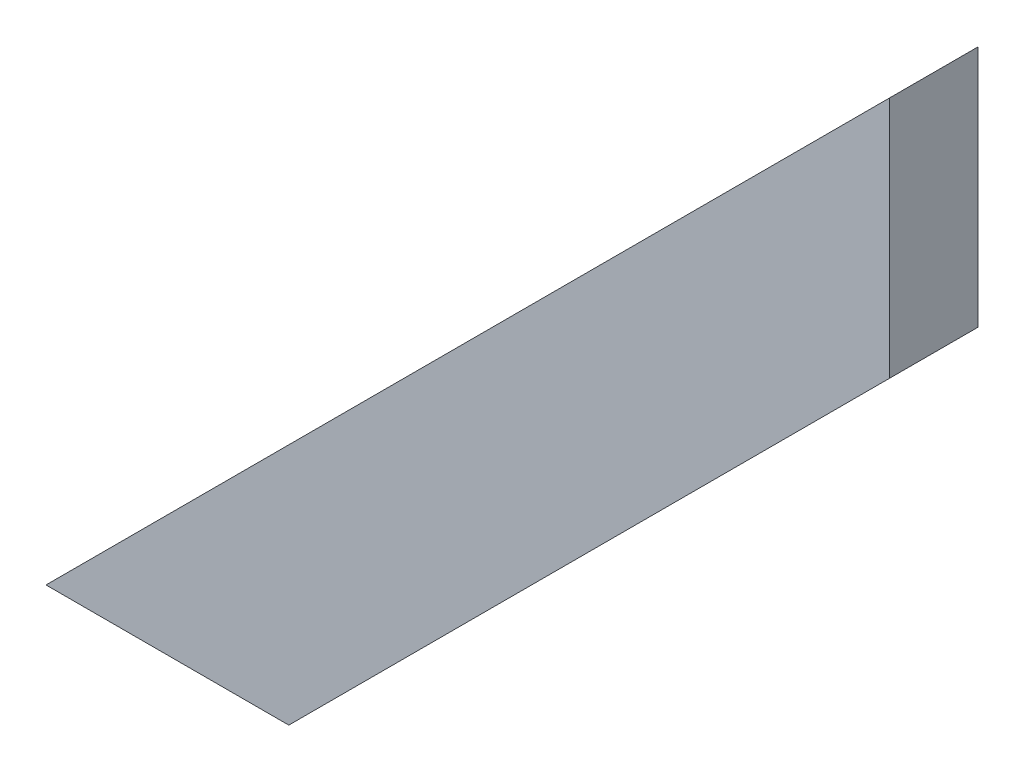
ISO-10303-21;
HEADER;
FILE_DESCRIPTION(('STEP AP214'),'2;1');
FILE_NAME('part.step','',(''),(''),'','','');
FILE_SCHEMA(('AUTOMOTIVE_DESIGN { 1 0 10303 214 1 1 1 1 }'));
ENDSEC;
DATA;
#1=APPLICATION_CONTEXT('core data for automotive mechanical design processes');
#2=APPLICATION_PROTOCOL_DEFINITION('international standard','automotive_design',2000,#1);
#3=PRODUCT_CONTEXT('',#1,'mechanical');
#4=PRODUCT('Part','Part','',(#3));
#5=PRODUCT_RELATED_PRODUCT_CATEGORY('part','',(#4));
#6=PRODUCT_DEFINITION_FORMATION('','',#4);
#7=PRODUCT_DEFINITION_CONTEXT('part definition',#1,'design');
#8=PRODUCT_DEFINITION('design','',#6,#7);
#9=PRODUCT_DEFINITION_SHAPE('','',#8);
#10=(LENGTH_UNIT() NAMED_UNIT(*) SI_UNIT(.MILLI.,.METRE.));
#11=(NAMED_UNIT(*) PLANE_ANGLE_UNIT() SI_UNIT($,.RADIAN.));
#12=(NAMED_UNIT(*) SI_UNIT($,.STERADIAN.) SOLID_ANGLE_UNIT());
#13=UNCERTAINTY_MEASURE_WITH_UNIT(LENGTH_MEASURE(1.E-05),#10,'distance_accuracy_value','');
#14=(GEOMETRIC_REPRESENTATION_CONTEXT(3) GLOBAL_UNCERTAINTY_ASSIGNED_CONTEXT((#13)) GLOBAL_UNIT_ASSIGNED_CONTEXT((#10,
#11,#12)) REPRESENTATION_CONTEXT('',''));
#15=CARTESIAN_POINT('',(0.,0.,0.));
#16=DIRECTION('',(0.,0.,1.));
#17=DIRECTION('',(1.,0.,0.));
#18=AXIS2_PLACEMENT_3D('',#15,#16,#17);
#19=CARTESIAN_POINT('',(0.,0.,18.));
#20=DIRECTION('',(0.,1.,0.));
#21=DIRECTION('',(0.,0.,1.));
#22=AXIS2_PLACEMENT_3D('',#19,#20,#21);
#23=PLANE('',#22);
#24=DIRECTION('',(1.,0.,0.));
#25=VECTOR('',#24,1.);
#26=CARTESIAN_POINT('',(0.,0.,0.));
#27=LINE('',#26,#25);
#28=CARTESIAN_POINT('',(0.,0.,0.));
#29=VERTEX_POINT('',#28);
#30=CARTESIAN_POINT('',(49.4974746830583,0.,0.));
#31=VERTEX_POINT('',#30);
#32=EDGE_CURVE('E96',#29,#31,#27,.T.);
#33=ORIENTED_EDGE('',*,*,#32,.T.);
#34=DIRECTION('',(0.,0.,-1.));
#35=VECTOR('',#34,1.);
#36=CARTESIAN_POINT('',(49.4974746830583,0.,18.));
#37=LINE('',#36,#35);
#38=CARTESIAN_POINT('',(49.4974746830583,0.,18.));
#39=VERTEX_POINT('',#38);
#40=EDGE_CURVE('E11',#39,#31,#37,.T.);
#41=ORIENTED_EDGE('',*,*,#40,.F.);
#42=DIRECTION('',(1.,0.,0.));
#43=VECTOR('',#42,1.);
#44=CARTESIAN_POINT('',(0.,0.,18.));
#45=LINE('',#44,#43);
#46=CARTESIAN_POINT('',(0.,0.,18.));
#47=VERTEX_POINT('',#46);
#48=EDGE_CURVE('E84',#47,#39,#45,.T.);
#49=ORIENTED_EDGE('',*,*,#48,.F.);
#50=DIRECTION('',(0.,0.,-1.));
#51=VECTOR('',#50,1.);
#52=CARTESIAN_POINT('',(0.,0.,18.));
#53=LINE('',#52,#51);
#54=EDGE_CURVE('E92',#47,#29,#53,.T.);
#55=ORIENTED_EDGE('',*,*,#54,.T.);
#56=EDGE_LOOP('',(#33,#41,#49,#55));
#57=FACE_BOUND('',#56,.T.);
#58=ADVANCED_FACE('F33',(#57),#23,.F.);
#59=CARTESIAN_POINT('',(49.4974746830583,0.,18.));
#60=DIRECTION('',(-0.707106781186547,0.707106781186547,0.));
#61=DIRECTION('',(-0.707106781186548,-0.707106781186548,0.));
#62=AXIS2_PLACEMENT_3D('',#59,#60,#61);
#63=PLANE('',#62);
#64=DIRECTION('',(0.707106781186548,0.707106781186548,0.));
#65=VECTOR('',#64,1.);
#66=CARTESIAN_POINT('',(49.4974746830583,0.,0.));
#67=LINE('',#66,#65);
#68=CARTESIAN_POINT('',(172.,122.502525316942,0.));
#69=VERTEX_POINT('',#68);
#70=EDGE_CURVE('E88',#31,#69,#67,.T.);
#71=ORIENTED_EDGE('',*,*,#70,.T.);
#72=DIRECTION('',(0.,0.,-1.));
#73=VECTOR('',#72,1.);
#74=CARTESIAN_POINT('',(172.,122.502525316942,18.));
#75=LINE('',#74,#73);
#76=CARTESIAN_POINT('',(172.,122.502525316942,18.));
#77=VERTEX_POINT('',#76);
#78=EDGE_CURVE('E41',#77,#69,#75,.T.);
#79=ORIENTED_EDGE('',*,*,#78,.F.);
#80=DIRECTION('',(0.707106781186548,0.707106781186548,0.));
#81=VECTOR('',#80,1.);
#82=CARTESIAN_POINT('',(49.4974746830583,0.,18.));
#83=LINE('',#82,#81);
#84=EDGE_CURVE('E79',#39,#77,#83,.T.);
#85=ORIENTED_EDGE('',*,*,#84,.F.);
#86=ORIENTED_EDGE('',*,*,#40,.T.);
#87=EDGE_LOOP('',(#71,#79,#85,#86));
#88=FACE_BOUND('',#87,.T.);
#89=ADVANCED_FACE('F87',(#88),#63,.F.);
#90=CARTESIAN_POINT('',(172.,122.502525316942,18.));
#91=DIRECTION('',(-1.,0.,0.));
#92=DIRECTION('',(0.,0.,1.));
#93=AXIS2_PLACEMENT_3D('',#90,#91,#92);
#94=PLANE('',#93);
#95=DIRECTION('',(0.,1.,0.));
#96=VECTOR('',#95,1.);
#97=CARTESIAN_POINT('',(172.,122.502525316942,0.));
#98=LINE('',#97,#96);
#99=CARTESIAN_POINT('',(172.,172.,0.));
#100=VERTEX_POINT('',#99);
#101=EDGE_CURVE('E66',#69,#100,#98,.T.);
#102=ORIENTED_EDGE('',*,*,#101,.T.);
#103=DIRECTION('',(0.,0.,-1.));
#104=VECTOR('',#103,1.);
#105=CARTESIAN_POINT('',(172.,172.,18.));
#106=LINE('',#105,#104);
#107=CARTESIAN_POINT('',(172.,172.,18.));
#108=VERTEX_POINT('',#107);
#109=EDGE_CURVE('E89',#108,#100,#106,.T.);
#110=ORIENTED_EDGE('',*,*,#109,.F.);
#111=DIRECTION('',(0.,1.,0.));
#112=VECTOR('',#111,1.);
#113=CARTESIAN_POINT('',(172.,122.502525316942,18.));
#114=LINE('',#113,#112);
#115=EDGE_CURVE('E82',#77,#108,#114,.T.);
#116=ORIENTED_EDGE('',*,*,#115,.F.);
#117=ORIENTED_EDGE('',*,*,#78,.T.);
#118=EDGE_LOOP('',(#102,#110,#116,#117));
#119=FACE_BOUND('',#118,.T.);
#120=ADVANCED_FACE('F90',(#119),#94,.F.);
#121=CARTESIAN_POINT('',(0.,0.,18.));
#122=DIRECTION('',(0.707106781186547,-0.707106781186547,0.));
#123=DIRECTION('',(0.707106781186548,0.707106781186548,0.));
#124=AXIS2_PLACEMENT_3D('',#121,#122,#123);
#125=PLANE('',#124);
#126=DIRECTION('',(-0.707106781186548,-0.707106781186548,0.));
#127=VECTOR('',#126,1.);
#128=CARTESIAN_POINT('',(0.,0.,0.));
#129=LINE('',#128,#127);
#130=EDGE_CURVE('E72',#100,#29,#129,.T.);
#131=ORIENTED_EDGE('',*,*,#130,.T.);
#132=ORIENTED_EDGE('',*,*,#54,.F.);
#133=DIRECTION('',(-0.707106781186548,-0.707106781186548,0.));
#134=VECTOR('',#133,1.);
#135=CARTESIAN_POINT('',(0.,0.,18.));
#136=LINE('',#135,#134);
#137=EDGE_CURVE('E49',#108,#47,#136,.T.);
#138=ORIENTED_EDGE('',*,*,#137,.F.);
#139=ORIENTED_EDGE('',*,*,#109,.T.);
#140=EDGE_LOOP('',(#131,#132,#138,#139));
#141=FACE_BOUND('',#140,.T.);
#142=ADVANCED_FACE('F103',(#141),#125,.F.);
#143=CARTESIAN_POINT('',(0.,0.,18.));
#144=DIRECTION('',(0.,0.,1.));
#145=DIRECTION('',(1.,0.,0.));
#146=AXIS2_PLACEMENT_3D('',#143,#144,#145);
#147=PLANE('',#146);
#148=ORIENTED_EDGE('',*,*,#48,.T.);
#149=ORIENTED_EDGE('',*,*,#84,.T.);
#150=ORIENTED_EDGE('',*,*,#115,.T.);
#151=ORIENTED_EDGE('',*,*,#137,.T.);
#152=EDGE_LOOP('',(#148,#149,#150,#151));
#153=FACE_BOUND('',#152,.T.);
#154=ADVANCED_FACE('F80',(#153),#147,.T.);
#155=CARTESIAN_POINT('',(0.,0.,0.));
#156=DIRECTION('',(0.,0.,1.));
#157=DIRECTION('',(1.,0.,0.));
#158=AXIS2_PLACEMENT_3D('',#155,#156,#157);
#159=PLANE('',#158);
#160=ORIENTED_EDGE('',*,*,#32,.F.);
#161=ORIENTED_EDGE('',*,*,#130,.F.);
#162=ORIENTED_EDGE('',*,*,#101,.F.);
#163=ORIENTED_EDGE('',*,*,#70,.F.);
#164=EDGE_LOOP('',(#160,#161,#162,#163));
#165=FACE_BOUND('',#164,.T.);
#166=ADVANCED_FACE('F106',(#165),#159,.F.);
#167=CLOSED_SHELL('',(#58,#89,#120,#142,#154,#166));
#168=MANIFOLD_SOLID_BREP('B2',#167);
#169=ADVANCED_BREP_SHAPE_REPRESENTATION('',(#18,#168),#14);
#170=SHAPE_DEFINITION_REPRESENTATION(#9,#169);
ENDSEC;
END-ISO-10303-21;
